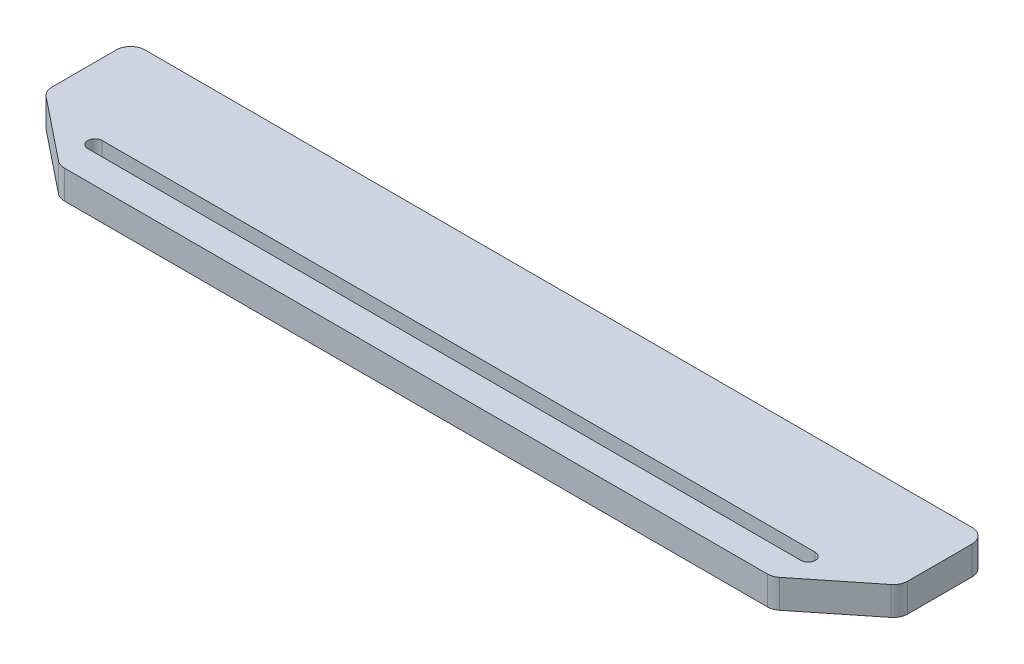
ISO-10303-21;
HEADER;
FILE_DESCRIPTION(('STEP AP214'),'2;1');
FILE_NAME('part.step','',(''),(''),'','','');
FILE_SCHEMA(('AUTOMOTIVE_DESIGN { 1 0 10303 214 1 1 1 1 }'));
ENDSEC;
DATA;
#1=APPLICATION_CONTEXT('core data for automotive mechanical design processes');
#2=APPLICATION_PROTOCOL_DEFINITION('international standard','automotive_design',2000,#1);
#3=PRODUCT_CONTEXT('',#1,'mechanical');
#4=PRODUCT('Part','Part','',(#3));
#5=PRODUCT_RELATED_PRODUCT_CATEGORY('part','',(#4));
#6=PRODUCT_DEFINITION_FORMATION('','',#4);
#7=PRODUCT_DEFINITION_CONTEXT('part definition',#1,'design');
#8=PRODUCT_DEFINITION('design','',#6,#7);
#9=PRODUCT_DEFINITION_SHAPE('','',#8);
#10=(LENGTH_UNIT() NAMED_UNIT(*) SI_UNIT(.MILLI.,.METRE.));
#11=(NAMED_UNIT(*) PLANE_ANGLE_UNIT() SI_UNIT($,.RADIAN.));
#12=(NAMED_UNIT(*) SI_UNIT($,.STERADIAN.) SOLID_ANGLE_UNIT());
#13=UNCERTAINTY_MEASURE_WITH_UNIT(LENGTH_MEASURE(1.E-05),#10,'distance_accuracy_value','');
#14=(GEOMETRIC_REPRESENTATION_CONTEXT(3) GLOBAL_UNCERTAINTY_ASSIGNED_CONTEXT((#13)) GLOBAL_UNIT_ASSIGNED_CONTEXT((#10,
#11,#12)) REPRESENTATION_CONTEXT('',''));
#15=CARTESIAN_POINT('',(0.,0.,0.));
#16=DIRECTION('',(0.,0.,1.));
#17=DIRECTION('',(1.,0.,0.));
#18=AXIS2_PLACEMENT_3D('',#15,#16,#17);
#19=CARTESIAN_POINT('',(295.,10.,5.));
#20=DIRECTION('',(0.,1.,0.));
#21=DIRECTION('',(0.,0.,1.));
#22=AXIS2_PLACEMENT_3D('',#19,#20,#21);
#23=PLANE('',#22);
#24=CARTESIAN_POINT('',(295.,10.,5.));
#25=DIRECTION('',(0.,1.,0.));
#26=DIRECTION('',(0.,0.,1.));
#27=AXIS2_PLACEMENT_3D('',#24,#25,#26);
#28=CIRCLE('',#27,5.);
#29=CARTESIAN_POINT('',(300.,10.,5.00000000000004));
#30=VERTEX_POINT('',#29);
#31=CARTESIAN_POINT('',(295.,10.,0.));
#32=VERTEX_POINT('',#31);
#33=EDGE_CURVE('E174',#30,#32,#28,.T.);
#34=ORIENTED_EDGE('',*,*,#33,.T.);
#35=DIRECTION('',(-1.,0.,0.));
#36=VECTOR('',#35,1.);
#37=CARTESIAN_POINT('',(5.00000000000004,10.,0.));
#38=LINE('',#37,#36);
#39=CARTESIAN_POINT('',(5.,10.,0.));
#40=VERTEX_POINT('',#39);
#41=EDGE_CURVE('E135',#32,#40,#38,.T.);
#42=ORIENTED_EDGE('',*,*,#41,.T.);
#43=CARTESIAN_POINT('',(5.,10.,5.));
#44=DIRECTION('',(0.,1.,0.));
#45=DIRECTION('',(0.,0.,-1.));
#46=AXIS2_PLACEMENT_3D('',#43,#44,#45);
#47=CIRCLE('',#46,5.);
#48=CARTESIAN_POINT('',(0.,10.,5.00000000000004));
#49=VERTEX_POINT('',#48);
#50=EDGE_CURVE('E185',#40,#49,#47,.T.);
#51=ORIENTED_EDGE('',*,*,#50,.T.);
#52=DIRECTION('',(0.,0.,1.));
#53=VECTOR('',#52,1.);
#54=CARTESIAN_POINT('',(0.,10.,5.00000000000004));
#55=LINE('',#54,#53);
#56=CARTESIAN_POINT('',(0.,10.,27.5968757625671));
#57=VERTEX_POINT('',#56);
#58=EDGE_CURVE('E193',#49,#57,#55,.T.);
#59=ORIENTED_EDGE('',*,*,#58,.T.);
#60=CARTESIAN_POINT('',(5.00000000000001,10.,27.5968757625672));
#61=DIRECTION('',(0.,1.,0.));
#62=DIRECTION('',(0.,0.,-1.));
#63=AXIS2_PLACEMENT_3D('',#60,#61,#62);
#64=CIRCLE('',#63,5.);
#65=CARTESIAN_POINT('',(1.87652476222791,10.,31.5012198097823));
#66=VERTEX_POINT('',#65);
#67=EDGE_CURVE('E195',#57,#66,#64,.T.);
#68=ORIENTED_EDGE('',*,*,#67,.T.);
#69=DIRECTION('',(0.78086880944303,0.,0.624695047554425));
#70=VECTOR('',#69,1.);
#71=CARTESIAN_POINT('',(1.87652476222791,10.,31.5012198097823));
#72=LINE('',#71,#70);
#73=CARTESIAN_POINT('',(23.6304300590189,10.,48.9043440472151));
#74=VERTEX_POINT('',#73);
#75=EDGE_CURVE('E197',#66,#74,#72,.T.);
#76=ORIENTED_EDGE('',*,*,#75,.T.);
#77=CARTESIAN_POINT('',(26.7539052967911,10.,45.));
#78=DIRECTION('',(0.,1.,0.));
#79=DIRECTION('',(0.,0.,1.));
#80=AXIS2_PLACEMENT_3D('',#77,#78,#79);
#81=CIRCLE('',#80,5.);
#82=CARTESIAN_POINT('',(26.7539052967911,10.,50.));
#83=VERTEX_POINT('',#82);
#84=EDGE_CURVE('E199',#74,#83,#81,.T.);
#85=ORIENTED_EDGE('',*,*,#84,.T.);
#86=DIRECTION('',(1.,0.,0.));
#87=VECTOR('',#86,1.);
#88=CARTESIAN_POINT('',(26.7539052967911,10.,50.));
#89=LINE('',#88,#87);
#90=CARTESIAN_POINT('',(273.246094703209,10.,50.));
#91=VERTEX_POINT('',#90);
#92=EDGE_CURVE('E201',#83,#91,#89,.T.);
#93=ORIENTED_EDGE('',*,*,#92,.T.);
#94=CARTESIAN_POINT('',(273.246094703209,10.,45.));
#95=DIRECTION('',(0.,1.,0.));
#96=DIRECTION('',(0.,0.,-1.));
#97=AXIS2_PLACEMENT_3D('',#94,#95,#96);
#98=CIRCLE('',#97,5.00000000000001);
#99=CARTESIAN_POINT('',(276.369569940981,10.,48.9043440472151));
#100=VERTEX_POINT('',#99);
#101=EDGE_CURVE('E203',#91,#100,#98,.T.);
#102=ORIENTED_EDGE('',*,*,#101,.T.);
#103=DIRECTION('',(0.78086880944303,0.,-0.624695047554425));
#104=VECTOR('',#103,1.);
#105=CARTESIAN_POINT('',(276.369569940981,10.,48.9043440472151));
#106=LINE('',#105,#104);
#107=CARTESIAN_POINT('',(298.123475237772,10.,31.5012198097823));
#108=VERTEX_POINT('',#107);
#109=EDGE_CURVE('E205',#100,#108,#106,.T.);
#110=ORIENTED_EDGE('',*,*,#109,.T.);
#111=CARTESIAN_POINT('',(295.,10.,27.5968757625672));
#112=DIRECTION('',(0.,1.,0.));
#113=DIRECTION('',(0.,0.,-1.));
#114=AXIS2_PLACEMENT_3D('',#111,#112,#113);
#115=CIRCLE('',#114,5.00000000000001);
#116=CARTESIAN_POINT('',(300.,10.,27.5968757625671));
#117=VERTEX_POINT('',#116);
#118=EDGE_CURVE('E169',#108,#117,#115,.T.);
#119=ORIENTED_EDGE('',*,*,#118,.T.);
#120=DIRECTION('',(0.,0.,-1.));
#121=VECTOR('',#120,1.);
#122=CARTESIAN_POINT('',(300.,10.,5.00000000000004));
#123=LINE('',#122,#121);
#124=EDGE_CURVE('E171',#117,#30,#123,.T.);
#125=ORIENTED_EDGE('',*,*,#124,.T.);
#126=EDGE_LOOP('',(#34,#42,#51,#59,#68,#76,#85,#93,#102,#110,#119,#125));
#127=FACE_BOUND('',#126,.T.);
#128=DIRECTION('',(1.,0.,0.));
#129=VECTOR('',#128,1.);
#130=CARTESIAN_POINT('',(25.,10.,40.));
#131=LINE('',#130,#129);
#132=CARTESIAN_POINT('',(25.,10.,40.));
#133=VERTEX_POINT('',#132);
#134=CARTESIAN_POINT('',(275.,10.,40.));
#135=VERTEX_POINT('',#134);
#136=EDGE_CURVE('E271',#133,#135,#131,.T.);
#137=ORIENTED_EDGE('',*,*,#136,.F.);
#138=CARTESIAN_POINT('',(25.,10.,37.5));
#139=DIRECTION('',(0.,1.,0.));
#140=DIRECTION('',(0.,0.,1.));
#141=AXIS2_PLACEMENT_3D('',#138,#139,#140);
#142=CIRCLE('',#141,2.49999999999999);
#143=CARTESIAN_POINT('',(25.,10.,35.));
#144=VERTEX_POINT('',#143);
#145=EDGE_CURVE('E281',#144,#133,#142,.T.);
#146=ORIENTED_EDGE('',*,*,#145,.F.);
#147=DIRECTION('',(-1.,0.,0.));
#148=VECTOR('',#147,1.);
#149=CARTESIAN_POINT('',(25.,10.,35.));
#150=LINE('',#149,#148);
#151=CARTESIAN_POINT('',(275.,10.,35.));
#152=VERTEX_POINT('',#151);
#153=EDGE_CURVE('E284',#152,#144,#150,.T.);
#154=ORIENTED_EDGE('',*,*,#153,.F.);
#155=CARTESIAN_POINT('',(275.,10.,37.5));
#156=DIRECTION('',(0.,1.,0.));
#157=DIRECTION('',(0.,0.,1.));
#158=AXIS2_PLACEMENT_3D('',#155,#156,#157);
#159=CIRCLE('',#158,2.49999999999999);
#160=EDGE_CURVE('E287',#135,#152,#159,.T.);
#161=ORIENTED_EDGE('',*,*,#160,.F.);
#162=EDGE_LOOP('',(#137,#146,#154,#161));
#163=FACE_BOUND('',#162,.T.);
#164=ADVANCED_FACE('F41',(#127,#163),#23,.T.);
#165=CARTESIAN_POINT('',(295.,0.,5.));
#166=DIRECTION('',(0.,1.,0.));
#167=DIRECTION('',(0.,0.,1.));
#168=AXIS2_PLACEMENT_3D('',#165,#166,#167);
#169=PLANE('',#168);
#170=CARTESIAN_POINT('',(295.,0.,5.));
#171=DIRECTION('',(0.,1.,0.));
#172=DIRECTION('',(0.,0.,1.));
#173=AXIS2_PLACEMENT_3D('',#170,#171,#172);
#174=CIRCLE('',#173,5.);
#175=CARTESIAN_POINT('',(300.,0.,5.00000000000004));
#176=VERTEX_POINT('',#175);
#177=CARTESIAN_POINT('',(295.,0.,0.));
#178=VERTEX_POINT('',#177);
#179=EDGE_CURVE('E208',#176,#178,#174,.T.);
#180=ORIENTED_EDGE('',*,*,#179,.F.);
#181=DIRECTION('',(0.,0.,-1.));
#182=VECTOR('',#181,1.);
#183=CARTESIAN_POINT('',(300.,0.,5.00000000000004));
#184=LINE('',#183,#182);
#185=CARTESIAN_POINT('',(300.,0.,27.5968757625671));
#186=VERTEX_POINT('',#185);
#187=EDGE_CURVE('E127',#186,#176,#184,.T.);
#188=ORIENTED_EDGE('',*,*,#187,.F.);
#189=CARTESIAN_POINT('',(295.,0.,27.5968757625672));
#190=DIRECTION('',(0.,1.,0.));
#191=DIRECTION('',(0.,0.,-1.));
#192=AXIS2_PLACEMENT_3D('',#189,#190,#191);
#193=CIRCLE('',#192,5.00000000000001);
#194=CARTESIAN_POINT('',(298.123475237772,0.,31.5012198097823));
#195=VERTEX_POINT('',#194);
#196=EDGE_CURVE('E120',#195,#186,#193,.T.);
#197=ORIENTED_EDGE('',*,*,#196,.F.);
#198=DIRECTION('',(0.78086880944303,0.,-0.624695047554425));
#199=VECTOR('',#198,1.);
#200=CARTESIAN_POINT('',(276.369569940981,0.,48.9043440472151));
#201=LINE('',#200,#199);
#202=CARTESIAN_POINT('',(276.369569940981,0.,48.9043440472151));
#203=VERTEX_POINT('',#202);
#204=EDGE_CURVE('E226',#203,#195,#201,.T.);
#205=ORIENTED_EDGE('',*,*,#204,.F.);
#206=CARTESIAN_POINT('',(273.246094703209,0.,45.));
#207=DIRECTION('',(0.,1.,0.));
#208=DIRECTION('',(0.,0.,-1.));
#209=AXIS2_PLACEMENT_3D('',#206,#207,#208);
#210=CIRCLE('',#209,5.00000000000001);
#211=CARTESIAN_POINT('',(273.246094703209,0.,50.));
#212=VERTEX_POINT('',#211);
#213=EDGE_CURVE('E224',#212,#203,#210,.T.);
#214=ORIENTED_EDGE('',*,*,#213,.F.);
#215=DIRECTION('',(1.,0.,0.));
#216=VECTOR('',#215,1.);
#217=CARTESIAN_POINT('',(26.7539052967911,0.,50.));
#218=LINE('',#217,#216);
#219=CARTESIAN_POINT('',(26.7539052967911,0.,50.));
#220=VERTEX_POINT('',#219);
#221=EDGE_CURVE('E222',#220,#212,#218,.T.);
#222=ORIENTED_EDGE('',*,*,#221,.F.);
#223=CARTESIAN_POINT('',(26.7539052967911,0.,45.));
#224=DIRECTION('',(0.,1.,0.));
#225=DIRECTION('',(0.,0.,1.));
#226=AXIS2_PLACEMENT_3D('',#223,#224,#225);
#227=CIRCLE('',#226,5.);
#228=CARTESIAN_POINT('',(23.6304300590189,0.,48.9043440472151));
#229=VERTEX_POINT('',#228);
#230=EDGE_CURVE('E220',#229,#220,#227,.T.);
#231=ORIENTED_EDGE('',*,*,#230,.F.);
#232=DIRECTION('',(0.78086880944303,0.,0.624695047554425));
#233=VECTOR('',#232,1.);
#234=CARTESIAN_POINT('',(1.87652476222791,0.,31.5012198097823));
#235=LINE('',#234,#233);
#236=CARTESIAN_POINT('',(1.87652476222791,0.,31.5012198097823));
#237=VERTEX_POINT('',#236);
#238=EDGE_CURVE('E218',#237,#229,#235,.T.);
#239=ORIENTED_EDGE('',*,*,#238,.F.);
#240=CARTESIAN_POINT('',(5.00000000000001,0.,27.5968757625672));
#241=DIRECTION('',(0.,1.,0.));
#242=DIRECTION('',(0.,0.,-1.));
#243=AXIS2_PLACEMENT_3D('',#240,#241,#242);
#244=CIRCLE('',#243,5.);
#245=CARTESIAN_POINT('',(0.,0.,27.5968757625671));
#246=VERTEX_POINT('',#245);
#247=EDGE_CURVE('E216',#246,#237,#244,.T.);
#248=ORIENTED_EDGE('',*,*,#247,.F.);
#249=DIRECTION('',(0.,0.,1.));
#250=VECTOR('',#249,1.);
#251=CARTESIAN_POINT('',(0.,0.,5.00000000000004));
#252=LINE('',#251,#250);
#253=CARTESIAN_POINT('',(0.,0.,5.00000000000004));
#254=VERTEX_POINT('',#253);
#255=EDGE_CURVE('E214',#254,#246,#252,.T.);
#256=ORIENTED_EDGE('',*,*,#255,.F.);
#257=CARTESIAN_POINT('',(5.,0.,5.));
#258=DIRECTION('',(0.,1.,0.));
#259=DIRECTION('',(0.,0.,-1.));
#260=AXIS2_PLACEMENT_3D('',#257,#258,#259);
#261=CIRCLE('',#260,5.);
#262=CARTESIAN_POINT('',(5.,0.,0.));
#263=VERTEX_POINT('',#262);
#264=EDGE_CURVE('E212',#263,#254,#261,.T.);
#265=ORIENTED_EDGE('',*,*,#264,.F.);
#266=DIRECTION('',(-1.,0.,0.));
#267=VECTOR('',#266,1.);
#268=CARTESIAN_POINT('',(5.00000000000004,0.,0.));
#269=LINE('',#268,#267);
#270=EDGE_CURVE('E85',#178,#263,#269,.T.);
#271=ORIENTED_EDGE('',*,*,#270,.F.);
#272=EDGE_LOOP('',(#180,#188,#197,#205,#214,#222,#231,#239,#248,#256,#265,#271));
#273=FACE_BOUND('',#272,.T.);
#274=CARTESIAN_POINT('',(25.,0.,37.5));
#275=DIRECTION('',(0.,-1.,0.));
#276=DIRECTION('',(0.,0.,-1.));
#277=AXIS2_PLACEMENT_3D('',#274,#275,#276);
#278=CIRCLE('',#277,2.49999999999999);
#279=CARTESIAN_POINT('',(25.,0.,40.));
#280=VERTEX_POINT('',#279);
#281=CARTESIAN_POINT('',(25.,0.,35.));
#282=VERTEX_POINT('',#281);
#283=EDGE_CURVE('E11',#280,#282,#278,.T.);
#284=ORIENTED_EDGE('',*,*,#283,.F.);
#285=DIRECTION('',(-1.,0.,0.));
#286=VECTOR('',#285,1.);
#287=CARTESIAN_POINT('',(25.,0.,40.));
#288=LINE('',#287,#286);
#289=CARTESIAN_POINT('',(275.,0.,40.));
#290=VERTEX_POINT('',#289);
#291=EDGE_CURVE('E50',#290,#280,#288,.T.);
#292=ORIENTED_EDGE('',*,*,#291,.F.);
#293=CARTESIAN_POINT('',(275.,0.,37.5));
#294=DIRECTION('',(0.,-1.,0.));
#295=DIRECTION('',(0.,0.,-1.));
#296=AXIS2_PLACEMENT_3D('',#293,#294,#295);
#297=CIRCLE('',#296,2.49999999999999);
#298=CARTESIAN_POINT('',(275.,0.,35.));
#299=VERTEX_POINT('',#298);
#300=EDGE_CURVE('E259',#299,#290,#297,.T.);
#301=ORIENTED_EDGE('',*,*,#300,.F.);
#302=DIRECTION('',(1.,0.,0.));
#303=VECTOR('',#302,1.);
#304=CARTESIAN_POINT('',(25.,0.,35.));
#305=LINE('',#304,#303);
#306=EDGE_CURVE('E257',#282,#299,#305,.T.);
#307=ORIENTED_EDGE('',*,*,#306,.F.);
#308=EDGE_LOOP('',(#284,#292,#301,#307));
#309=FACE_BOUND('',#308,.T.);
#310=ADVANCED_FACE('F273',(#273,#309),#169,.F.);
#311=CARTESIAN_POINT('',(295.,10.,5.));
#312=DIRECTION('',(0.,-1.,0.));
#313=DIRECTION('',(0.,0.,-1.));
#314=AXIS2_PLACEMENT_3D('',#311,#312,#313);
#315=CYLINDRICAL_SURFACE('',#314,5.);
#316=ORIENTED_EDGE('',*,*,#179,.T.);
#317=DIRECTION('',(0.,-1.,0.));
#318=VECTOR('',#317,1.);
#319=CARTESIAN_POINT('',(295.,10.,0.));
#320=LINE('',#319,#318);
#321=EDGE_CURVE('E183',#32,#178,#320,.T.);
#322=ORIENTED_EDGE('',*,*,#321,.F.);
#323=ORIENTED_EDGE('',*,*,#33,.F.);
#324=DIRECTION('',(0.,-1.,0.));
#325=VECTOR('',#324,1.);
#326=CARTESIAN_POINT('',(300.,10.,5.00000000000004));
#327=LINE('',#326,#325);
#328=EDGE_CURVE('E176',#30,#176,#327,.T.);
#329=ORIENTED_EDGE('',*,*,#328,.T.);
#330=EDGE_LOOP('',(#316,#322,#323,#329));
#331=FACE_BOUND('',#330,.T.);
#332=ADVANCED_FACE('F43',(#331),#315,.T.);
#333=CARTESIAN_POINT('',(5.00000000000004,10.,0.));
#334=DIRECTION('',(0.,0.,1.));
#335=DIRECTION('',(1.,0.,0.));
#336=AXIS2_PLACEMENT_3D('',#333,#334,#335);
#337=PLANE('',#336);
#338=ORIENTED_EDGE('',*,*,#270,.T.);
#339=DIRECTION('',(0.,-1.,0.));
#340=VECTOR('',#339,1.);
#341=CARTESIAN_POINT('',(5.,10.,0.));
#342=LINE('',#341,#340);
#343=EDGE_CURVE('E253',#40,#263,#342,.T.);
#344=ORIENTED_EDGE('',*,*,#343,.F.);
#345=ORIENTED_EDGE('',*,*,#41,.F.);
#346=ORIENTED_EDGE('',*,*,#321,.T.);
#347=EDGE_LOOP('',(#338,#344,#345,#346));
#348=FACE_BOUND('',#347,.T.);
#349=ADVANCED_FACE('F343',(#348),#337,.F.);
#350=CARTESIAN_POINT('',(5.,10.,5.));
#351=DIRECTION('',(0.,-1.,0.));
#352=DIRECTION('',(0.,0.,-1.));
#353=AXIS2_PLACEMENT_3D('',#350,#351,#352);
#354=CYLINDRICAL_SURFACE('',#353,5.);
#355=ORIENTED_EDGE('',*,*,#264,.T.);
#356=DIRECTION('',(0.,-1.,0.));
#357=VECTOR('',#356,1.);
#358=CARTESIAN_POINT('',(0.,10.,5.00000000000004));
#359=LINE('',#358,#357);
#360=EDGE_CURVE('E250',#49,#254,#359,.T.);
#361=ORIENTED_EDGE('',*,*,#360,.F.);
#362=ORIENTED_EDGE('',*,*,#50,.F.);
#363=ORIENTED_EDGE('',*,*,#343,.T.);
#364=EDGE_LOOP('',(#355,#361,#362,#363));
#365=FACE_BOUND('',#364,.T.);
#366=ADVANCED_FACE('F340',(#365),#354,.T.);
#367=CARTESIAN_POINT('',(0.,10.,5.00000000000004));
#368=DIRECTION('',(1.,0.,0.));
#369=DIRECTION('',(0.,0.,-1.));
#370=AXIS2_PLACEMENT_3D('',#367,#368,#369);
#371=PLANE('',#370);
#372=ORIENTED_EDGE('',*,*,#255,.T.);
#373=DIRECTION('',(0.,-1.,0.));
#374=VECTOR('',#373,1.);
#375=CARTESIAN_POINT('',(0.,10.,27.5968757625671));
#376=LINE('',#375,#374);
#377=EDGE_CURVE('E247',#57,#246,#376,.T.);
#378=ORIENTED_EDGE('',*,*,#377,.F.);
#379=ORIENTED_EDGE('',*,*,#58,.F.);
#380=ORIENTED_EDGE('',*,*,#360,.T.);
#381=EDGE_LOOP('',(#372,#378,#379,#380));
#382=FACE_BOUND('',#381,.T.);
#383=ADVANCED_FACE('F336',(#382),#371,.F.);
#384=CARTESIAN_POINT('',(5.00000000000001,10.,27.5968757625672));
#385=DIRECTION('',(0.,-1.,0.));
#386=DIRECTION('',(0.,0.,-1.));
#387=AXIS2_PLACEMENT_3D('',#384,#385,#386);
#388=CYLINDRICAL_SURFACE('',#387,5.);
#389=ORIENTED_EDGE('',*,*,#247,.T.);
#390=DIRECTION('',(0.,-1.,0.));
#391=VECTOR('',#390,1.);
#392=CARTESIAN_POINT('',(1.87652476222791,10.,31.5012198097823));
#393=LINE('',#392,#391);
#394=EDGE_CURVE('E244',#66,#237,#393,.T.);
#395=ORIENTED_EDGE('',*,*,#394,.F.);
#396=ORIENTED_EDGE('',*,*,#67,.F.);
#397=ORIENTED_EDGE('',*,*,#377,.T.);
#398=EDGE_LOOP('',(#389,#395,#396,#397));
#399=FACE_BOUND('',#398,.T.);
#400=ADVANCED_FACE('F332',(#399),#388,.T.);
#401=CARTESIAN_POINT('',(1.87652476222791,10.,31.5012198097823));
#402=DIRECTION('',(0.624695047554425,0.,-0.78086880944303));
#403=DIRECTION('',(-0.78086880944303,0.,-0.624695047554425));
#404=AXIS2_PLACEMENT_3D('',#401,#402,#403);
#405=PLANE('',#404);
#406=ORIENTED_EDGE('',*,*,#238,.T.);
#407=DIRECTION('',(0.,-1.,0.));
#408=VECTOR('',#407,1.);
#409=CARTESIAN_POINT('',(23.6304300590189,10.,48.9043440472151));
#410=LINE('',#409,#408);
#411=EDGE_CURVE('E241',#74,#229,#410,.T.);
#412=ORIENTED_EDGE('',*,*,#411,.F.);
#413=ORIENTED_EDGE('',*,*,#75,.F.);
#414=ORIENTED_EDGE('',*,*,#394,.T.);
#415=EDGE_LOOP('',(#406,#412,#413,#414));
#416=FACE_BOUND('',#415,.T.);
#417=ADVANCED_FACE('F328',(#416),#405,.F.);
#418=CARTESIAN_POINT('',(26.7539052967911,10.,45.));
#419=DIRECTION('',(0.,-1.,0.));
#420=DIRECTION('',(0.,0.,-1.));
#421=AXIS2_PLACEMENT_3D('',#418,#419,#420);
#422=CYLINDRICAL_SURFACE('',#421,5.);
#423=ORIENTED_EDGE('',*,*,#230,.T.);
#424=DIRECTION('',(0.,-1.,0.));
#425=VECTOR('',#424,1.);
#426=CARTESIAN_POINT('',(26.7539052967911,10.,50.));
#427=LINE('',#426,#425);
#428=EDGE_CURVE('E238',#83,#220,#427,.T.);
#429=ORIENTED_EDGE('',*,*,#428,.F.);
#430=ORIENTED_EDGE('',*,*,#84,.F.);
#431=ORIENTED_EDGE('',*,*,#411,.T.);
#432=EDGE_LOOP('',(#423,#429,#430,#431));
#433=FACE_BOUND('',#432,.T.);
#434=ADVANCED_FACE('F324',(#433),#422,.T.);
#435=CARTESIAN_POINT('',(26.7539052967911,10.,50.));
#436=DIRECTION('',(0.,0.,-1.));
#437=DIRECTION('',(-1.,0.,0.));
#438=AXIS2_PLACEMENT_3D('',#435,#436,#437);
#439=PLANE('',#438);
#440=ORIENTED_EDGE('',*,*,#221,.T.);
#441=DIRECTION('',(0.,-1.,0.));
#442=VECTOR('',#441,1.);
#443=CARTESIAN_POINT('',(273.246094703209,10.,50.));
#444=LINE('',#443,#442);
#445=EDGE_CURVE('E235',#91,#212,#444,.T.);
#446=ORIENTED_EDGE('',*,*,#445,.F.);
#447=ORIENTED_EDGE('',*,*,#92,.F.);
#448=ORIENTED_EDGE('',*,*,#428,.T.);
#449=EDGE_LOOP('',(#440,#446,#447,#448));
#450=FACE_BOUND('',#449,.T.);
#451=ADVANCED_FACE('F320',(#450),#439,.F.);
#452=CARTESIAN_POINT('',(273.246094703209,10.,45.));
#453=DIRECTION('',(0.,-1.,0.));
#454=DIRECTION('',(0.,0.,-1.));
#455=AXIS2_PLACEMENT_3D('',#452,#453,#454);
#456=CYLINDRICAL_SURFACE('',#455,5.00000000000001);
#457=ORIENTED_EDGE('',*,*,#213,.T.);
#458=DIRECTION('',(0.,-1.,0.));
#459=VECTOR('',#458,1.);
#460=CARTESIAN_POINT('',(276.369569940981,10.,48.9043440472151));
#461=LINE('',#460,#459);
#462=EDGE_CURVE('E232',#100,#203,#461,.T.);
#463=ORIENTED_EDGE('',*,*,#462,.F.);
#464=ORIENTED_EDGE('',*,*,#101,.F.);
#465=ORIENTED_EDGE('',*,*,#445,.T.);
#466=EDGE_LOOP('',(#457,#463,#464,#465));
#467=FACE_BOUND('',#466,.T.);
#468=ADVANCED_FACE('F316',(#467),#456,.T.);
#469=CARTESIAN_POINT('',(276.369569940981,10.,48.9043440472151));
#470=DIRECTION('',(-0.624695047554425,0.,-0.78086880944303));
#471=DIRECTION('',(-0.78086880944303,0.,0.624695047554425));
#472=AXIS2_PLACEMENT_3D('',#469,#470,#471);
#473=PLANE('',#472);
#474=ORIENTED_EDGE('',*,*,#204,.T.);
#475=DIRECTION('',(0.,-1.,0.));
#476=VECTOR('',#475,1.);
#477=CARTESIAN_POINT('',(298.123475237772,10.,31.5012198097823));
#478=LINE('',#477,#476);
#479=EDGE_CURVE('E230',#108,#195,#478,.T.);
#480=ORIENTED_EDGE('',*,*,#479,.F.);
#481=ORIENTED_EDGE('',*,*,#109,.F.);
#482=ORIENTED_EDGE('',*,*,#462,.T.);
#483=EDGE_LOOP('',(#474,#480,#481,#482));
#484=FACE_BOUND('',#483,.T.);
#485=ADVANCED_FACE('F313',(#484),#473,.F.);
#486=CARTESIAN_POINT('',(295.,10.,27.5968757625672));
#487=DIRECTION('',(0.,-1.,0.));
#488=DIRECTION('',(0.,0.,-1.));
#489=AXIS2_PLACEMENT_3D('',#486,#487,#488);
#490=CYLINDRICAL_SURFACE('',#489,5.00000000000001);
#491=ORIENTED_EDGE('',*,*,#196,.T.);
#492=DIRECTION('',(0.,-1.,0.));
#493=VECTOR('',#492,1.);
#494=CARTESIAN_POINT('',(300.,10.,27.5968757625671));
#495=LINE('',#494,#493);
#496=EDGE_CURVE('E181',#117,#186,#495,.T.);
#497=ORIENTED_EDGE('',*,*,#496,.F.);
#498=ORIENTED_EDGE('',*,*,#118,.F.);
#499=ORIENTED_EDGE('',*,*,#479,.T.);
#500=EDGE_LOOP('',(#491,#497,#498,#499));
#501=FACE_BOUND('',#500,.T.);
#502=ADVANCED_FACE('F310',(#501),#490,.T.);
#503=CARTESIAN_POINT('',(300.,10.,5.00000000000004));
#504=DIRECTION('',(-1.,0.,0.));
#505=DIRECTION('',(0.,0.,1.));
#506=AXIS2_PLACEMENT_3D('',#503,#504,#505);
#507=PLANE('',#506);
#508=ORIENTED_EDGE('',*,*,#187,.T.);
#509=ORIENTED_EDGE('',*,*,#328,.F.);
#510=ORIENTED_EDGE('',*,*,#124,.F.);
#511=ORIENTED_EDGE('',*,*,#496,.T.);
#512=EDGE_LOOP('',(#508,#509,#510,#511));
#513=FACE_BOUND('',#512,.T.);
#514=ADVANCED_FACE('F178',(#513),#507,.F.);
#515=CARTESIAN_POINT('',(25.,10.,37.5));
#516=DIRECTION('',(0.,-1.,0.));
#517=DIRECTION('',(0.,0.,-1.));
#518=AXIS2_PLACEMENT_3D('',#515,#516,#517);
#519=CYLINDRICAL_SURFACE('',#518,2.49999999999999);
#520=ORIENTED_EDGE('',*,*,#283,.T.);
#521=DIRECTION('',(0.,-1.,0.));
#522=VECTOR('',#521,1.);
#523=CARTESIAN_POINT('',(25.,10.,35.));
#524=LINE('',#523,#522);
#525=EDGE_CURVE('E278',#144,#282,#524,.T.);
#526=ORIENTED_EDGE('',*,*,#525,.F.);
#527=ORIENTED_EDGE('',*,*,#145,.T.);
#528=DIRECTION('',(0.,-1.,0.));
#529=VECTOR('',#528,1.);
#530=CARTESIAN_POINT('',(25.,10.,40.));
#531=LINE('',#530,#529);
#532=EDGE_CURVE('E210',#133,#280,#531,.T.);
#533=ORIENTED_EDGE('',*,*,#532,.T.);
#534=EDGE_LOOP('',(#520,#526,#527,#533));
#535=FACE_BOUND('',#534,.T.);
#536=ADVANCED_FACE('F276',(#535),#519,.F.);
#537=CARTESIAN_POINT('',(25.,10.,40.));
#538=DIRECTION('',(0.,0.,-1.));
#539=DIRECTION('',(-1.,0.,0.));
#540=AXIS2_PLACEMENT_3D('',#537,#538,#539);
#541=PLANE('',#540);
#542=ORIENTED_EDGE('',*,*,#291,.T.);
#543=ORIENTED_EDGE('',*,*,#532,.F.);
#544=ORIENTED_EDGE('',*,*,#136,.T.);
#545=DIRECTION('',(0.,-1.,0.));
#546=VECTOR('',#545,1.);
#547=CARTESIAN_POINT('',(275.,10.,40.));
#548=LINE('',#547,#546);
#549=EDGE_CURVE('E189',#135,#290,#548,.T.);
#550=ORIENTED_EDGE('',*,*,#549,.T.);
#551=EDGE_LOOP('',(#542,#543,#544,#550));
#552=FACE_BOUND('',#551,.T.);
#553=ADVANCED_FACE('F269',(#552),#541,.T.);
#554=CARTESIAN_POINT('',(275.,10.,37.5));
#555=DIRECTION('',(0.,-1.,0.));
#556=DIRECTION('',(0.,0.,-1.));
#557=AXIS2_PLACEMENT_3D('',#554,#555,#556);
#558=CYLINDRICAL_SURFACE('',#557,2.49999999999999);
#559=ORIENTED_EDGE('',*,*,#300,.T.);
#560=ORIENTED_EDGE('',*,*,#549,.F.);
#561=ORIENTED_EDGE('',*,*,#160,.T.);
#562=DIRECTION('',(0.,-1.,0.));
#563=VECTOR('',#562,1.);
#564=CARTESIAN_POINT('',(275.,10.,35.));
#565=LINE('',#564,#563);
#566=EDGE_CURVE('E57',#152,#299,#565,.T.);
#567=ORIENTED_EDGE('',*,*,#566,.T.);
#568=EDGE_LOOP('',(#559,#560,#561,#567));
#569=FACE_BOUND('',#568,.T.);
#570=ADVANCED_FACE('F263',(#569),#558,.F.);
#571=CARTESIAN_POINT('',(25.,10.,35.));
#572=DIRECTION('',(0.,0.,1.));
#573=DIRECTION('',(1.,0.,0.));
#574=AXIS2_PLACEMENT_3D('',#571,#572,#573);
#575=PLANE('',#574);
#576=ORIENTED_EDGE('',*,*,#306,.T.);
#577=ORIENTED_EDGE('',*,*,#566,.F.);
#578=ORIENTED_EDGE('',*,*,#153,.T.);
#579=ORIENTED_EDGE('',*,*,#525,.T.);
#580=EDGE_LOOP('',(#576,#577,#578,#579));
#581=FACE_BOUND('',#580,.T.);
#582=ADVANCED_FACE('F291',(#581),#575,.T.);
#583=CLOSED_SHELL('',(#164,#310,#332,#349,#366,#383,#400,#417,#434,#451,#468,#485,#502,#514,
#536,#553,#570,#582));
#584=MANIFOLD_SOLID_BREP('B2',#583);
#585=ADVANCED_BREP_SHAPE_REPRESENTATION('',(#18,#584),#14);
#586=SHAPE_DEFINITION_REPRESENTATION(#9,#585);
ENDSEC;
END-ISO-10303-21;
